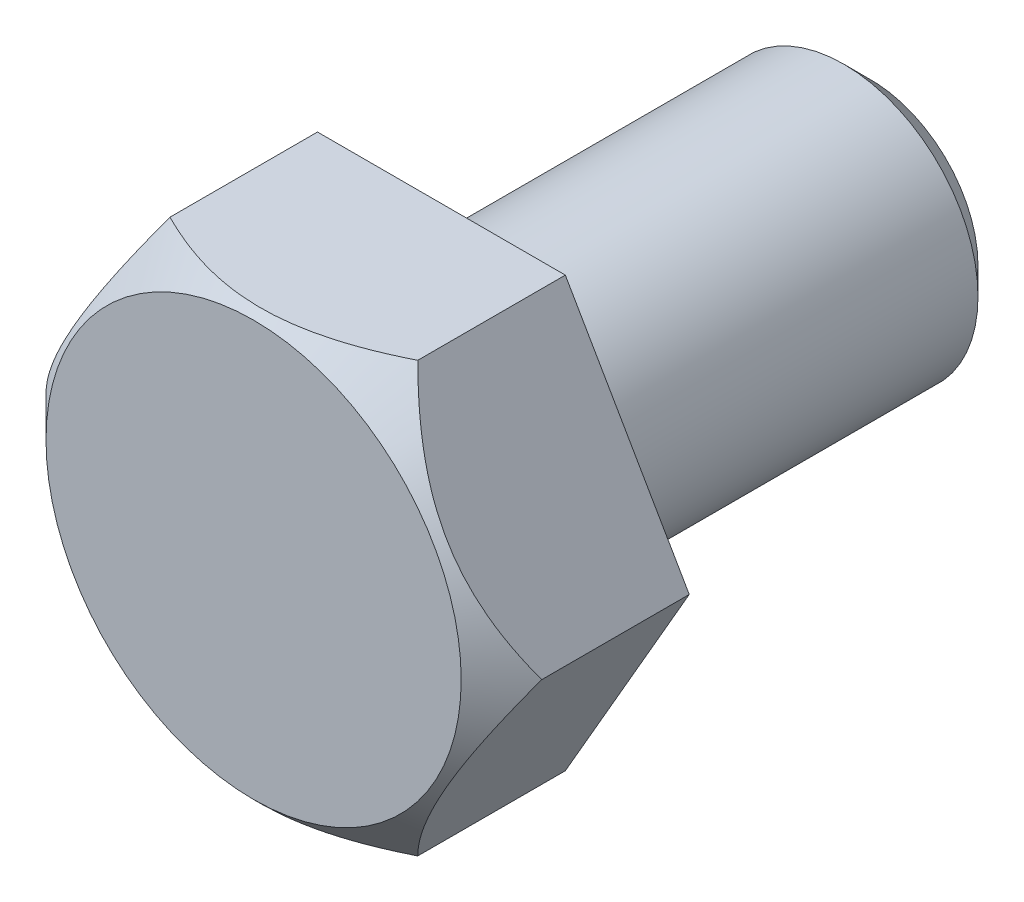
ISO-10303-21;
HEADER;
FILE_DESCRIPTION(('STEP AP214'),'2;1');
FILE_NAME('part.step','',(''),(''),'','','');
FILE_SCHEMA(('AUTOMOTIVE_DESIGN { 1 0 10303 214 1 1 1 1 }'));
ENDSEC;
DATA;
#1=APPLICATION_CONTEXT('core data for automotive mechanical design processes');
#2=APPLICATION_PROTOCOL_DEFINITION('international standard','automotive_design',2000,#1);
#3=PRODUCT_CONTEXT('',#1,'mechanical');
#4=PRODUCT('Part','Part','',(#3));
#5=PRODUCT_RELATED_PRODUCT_CATEGORY('part','',(#4));
#6=PRODUCT_DEFINITION_FORMATION('','',#4);
#7=PRODUCT_DEFINITION_CONTEXT('part definition',#1,'design');
#8=PRODUCT_DEFINITION('design','',#6,#7);
#9=PRODUCT_DEFINITION_SHAPE('','',#8);
#10=(LENGTH_UNIT() NAMED_UNIT(*) SI_UNIT(.MILLI.,.METRE.));
#11=(NAMED_UNIT(*) PLANE_ANGLE_UNIT() SI_UNIT($,.RADIAN.));
#12=(NAMED_UNIT(*) SI_UNIT($,.STERADIAN.) SOLID_ANGLE_UNIT());
#13=UNCERTAINTY_MEASURE_WITH_UNIT(LENGTH_MEASURE(1.E-05),#10,'distance_accuracy_value','');
#14=(GEOMETRIC_REPRESENTATION_CONTEXT(3) GLOBAL_UNCERTAINTY_ASSIGNED_CONTEXT((#13)) GLOBAL_UNIT_ASSIGNED_CONTEXT((#10,
#11,#12)) REPRESENTATION_CONTEXT('',''));
#15=CARTESIAN_POINT('',(0.,0.,0.));
#16=DIRECTION('',(0.,0.,1.));
#17=DIRECTION('',(1.,0.,0.));
#18=AXIS2_PLACEMENT_3D('',#15,#16,#17);
#19=CARTESIAN_POINT('',(2.30940107675854,-3.99999999999995,3.5));
#20=DIRECTION('',(-0.866025403784441,0.499999999999995,0.));
#21=DIRECTION('',(-0.499999999999995,-0.866025403784442,0.));
#22=AXIS2_PLACEMENT_3D('',#19,#20,#21);
#23=PLANE('',#22);
#24=CARTESIAN_POINT('',(2.3092856067047,-4.00019999999995,2.74988452561613));
#25=CARTESIAN_POINT('',(2.34899632674699,-3.93141901528157,2.78959114404243));
#26=CARTESIAN_POINT('',(2.38901092670863,-3.86211169510345,2.82807958288684));
#27=CARTESIAN_POINT('',(2.46971048312827,-3.72233596323636,2.90224877626448));
#28=CARTESIAN_POINT('',(2.51039579126541,-3.65186694242125,2.93792799726834));
#29=CARTESIAN_POINT('',(2.63392971018405,-3.43789991839606,3.04049913234899));
#30=CARTESIAN_POINT('',(2.71782823500147,-3.29258341073222,3.10248688898742));
#31=CARTESIAN_POINT('',(2.88698352725109,-2.99959785018671,3.20864413099057));
#32=CARTESIAN_POINT('',(2.9721975672662,-2.85200280336232,3.25308094454654));
#33=CARTESIAN_POINT('',(3.14450730387844,-2.5535535849111,3.32155101787052));
#34=CARTESIAN_POINT('',(3.23159772331383,-2.40270855359654,3.34563536213866));
#35=CARTESIAN_POINT('',(3.38169462438281,-2.14273309488641,3.36736511913944));
#36=CARTESIAN_POINT('',(3.44450772236847,-2.03393761779445,3.37058108535911));
#37=CARTESIAN_POINT('',(3.57003196860173,-1.81652324573664,3.36515994177497));
#38=CARTESIAN_POINT('',(3.63274307339633,-1.70790442603362,3.35651867682814));
#39=CARTESIAN_POINT('',(3.75757108217471,-1.49169597262182,3.32787596150354));
#40=CARTESIAN_POINT('',(3.81968724243515,-1.38410762707964,3.3078618054487));
#41=CARTESIAN_POINT('',(3.94285275199687,-1.17077870677863,3.25756584263531));
#42=CARTESIAN_POINT('',(4.00390218271577,-1.06503799100033,3.2272848231216));
#43=CARTESIAN_POINT('',(4.11227961083267,-0.877322779108212,3.16498474730574));
#44=CARTESIAN_POINT('',(4.15984755582569,-0.794932681568665,3.13460372013987));
#45=CARTESIAN_POINT('',(4.25412951504788,-0.631631537958687,3.06894553543963));
#46=CARTESIAN_POINT('',(4.30084350325071,-0.550720536967222,3.03366822896019));
#47=CARTESIAN_POINT('',(4.39327037218423,-0.390632503989856,2.95900831297905));
#48=CARTESIAN_POINT('',(4.43898588170051,-0.311450918813753,2.91963861299638));
#49=CARTESIAN_POINT('',(4.52957030284814,-0.15455409901184,2.83731089185669));
#50=CARTESIAN_POINT('',(4.5744397134526,-0.0768380001392329,2.79435507219803));
#51=CARTESIAN_POINT('',(4.61891762357082,0.000199999999999569,2.74988452561613));
#52=B_SPLINE_CURVE_WITH_KNOTS('',3,(#24,#25,#26,#27,#28,#29,#30,#31,#32,#33,#34,#35,#36,#37,#38,
#39,#40,#41,#42,#43,#44,#45,#46,#47,#48,#49,#50,#51),.UNSPECIFIED.,.F.,.F.,(4,2,2,2,2,2,2,2,2,2,
2,2,2,4),(0.,0.266361961703659,0.532868334400101,1.0687586568546,1.59613884594048,
2.12219135055576,2.49866160599654,2.8752638220349,3.25228760372073,3.62928248242854,
3.92874944437156,4.22822551811339,4.52678401907566,4.82516056577913),.UNSPECIFIED.);
#53=CARTESIAN_POINT('',(2.30940107675854,-3.99999999999995,2.74999999999999));
#54=VERTEX_POINT('',#53);
#55=CARTESIAN_POINT('',(4.61880215351698,0.,2.74999999999998));
#56=VERTEX_POINT('',#55);
#57=EDGE_CURVE('E107',#54,#56,#52,.T.);
#58=ORIENTED_EDGE('',*,*,#57,.F.);
#59=DIRECTION('',(0.,0.,-1.));
#60=VECTOR('',#59,1.);
#61=CARTESIAN_POINT('',(2.30940107675854,-3.99999999999995,3.5));
#62=LINE('',#61,#60);
#63=CARTESIAN_POINT('',(2.30940107675854,-3.99999999999995,0.));
#64=VERTEX_POINT('',#63);
#65=EDGE_CURVE('E76',#54,#64,#62,.T.);
#66=ORIENTED_EDGE('',*,*,#65,.T.);
#67=DIRECTION('',(0.499999999999995,0.866025403784441,0.));
#68=VECTOR('',#67,1.);
#69=CARTESIAN_POINT('',(2.30940107675854,-3.99999999999995,0.));
#70=LINE('',#69,#68);
#71=CARTESIAN_POINT('',(4.61880215351698,0.,0.));
#72=VERTEX_POINT('',#71);
#73=EDGE_CURVE('E163',#64,#72,#70,.T.);
#74=ORIENTED_EDGE('',*,*,#73,.T.);
#75=DIRECTION('',(0.,0.,-1.));
#76=VECTOR('',#75,1.);
#77=CARTESIAN_POINT('',(4.61880215351698,0.,3.5));
#78=LINE('',#77,#76);
#79=EDGE_CURVE('E114',#56,#72,#78,.T.);
#80=ORIENTED_EDGE('',*,*,#79,.F.);
#81=EDGE_LOOP('',(#58,#66,#74,#80));
#82=FACE_BOUND('',#81,.T.);
#83=ADVANCED_FACE('F50',(#82),#23,.F.);
#84=CARTESIAN_POINT('',(4.61880215351698,0.,3.5));
#85=DIRECTION('',(-0.866025403784438,-0.500000000000001,0.));
#86=DIRECTION('',(0.500000000000001,-0.866025403784438,0.));
#87=AXIS2_PLACEMENT_3D('',#84,#85,#86);
#88=PLANE('',#87);
#89=CARTESIAN_POINT('',(4.61891762357082,-0.000200000000000034,2.74988452561613));
#90=CARTESIAN_POINT('',(4.57920690352853,0.0685809847183838,2.78959114404243));
#91=CARTESIAN_POINT('',(4.53919230356689,0.137888304896502,2.82807958288684));
#92=CARTESIAN_POINT('',(4.45849274714724,0.277664036763594,2.90224877626448));
#93=CARTESIAN_POINT('',(4.41780743901011,0.348133057578705,2.93792799726834));
#94=CARTESIAN_POINT('',(4.29427352009146,0.562100081603903,3.04049913234899));
#95=CARTESIAN_POINT('',(4.21037499527404,0.707416589267746,3.10248688898743));
#96=CARTESIAN_POINT('',(4.04121970302442,1.00040214981326,3.20864413099058));
#97=CARTESIAN_POINT('',(3.9560056630093,1.14799719663764,3.25308094454655));
#98=CARTESIAN_POINT('',(3.78369592639705,1.44644641508887,3.32155101787054));
#99=CARTESIAN_POINT('',(3.69660550696167,1.59729144640344,3.34563536213868));
#100=CARTESIAN_POINT('',(3.54650860589268,1.85726690511356,3.36736511913945));
#101=CARTESIAN_POINT('',(3.48369550790702,1.96606238220553,3.37058108535913));
#102=CARTESIAN_POINT('',(3.35817126167376,2.18347675426333,3.36515994177498));
#103=CARTESIAN_POINT('',(3.29546015687916,2.29209557396635,3.35651867682816));
#104=CARTESIAN_POINT('',(3.17063214810078,2.50830402737816,3.32787596150355));
#105=CARTESIAN_POINT('',(3.10851598784034,2.61589237292033,3.30786180544872));
#106=CARTESIAN_POINT('',(2.98535047827861,2.82922129322134,3.25756584263533));
#107=CARTESIAN_POINT('',(2.92430104755971,2.93496200899964,3.22728482312162));
#108=CARTESIAN_POINT('',(2.81592361944281,3.12267722089176,3.16498474730576));
#109=CARTESIAN_POINT('',(2.76835567444979,3.20506731843131,3.13460372013988));
#110=CARTESIAN_POINT('',(2.67407371522759,3.36836846204129,3.06894553543965));
#111=CARTESIAN_POINT('',(2.62735972702477,3.44927946303276,3.03366822896021));
#112=CARTESIAN_POINT('',(2.53493285809125,3.60936749601012,2.95900831297906));
#113=CARTESIAN_POINT('',(2.48921734857496,3.68854908118623,2.91963861299639));
#114=CARTESIAN_POINT('',(2.39863292742733,3.84544590098814,2.83731089185669));
#115=CARTESIAN_POINT('',(2.35376351682286,3.92316199986075,2.79435507219804));
#116=CARTESIAN_POINT('',(2.30928560670464,4.00019999999999,2.74988452561613));
#117=B_SPLINE_CURVE_WITH_KNOTS('',3,(#89,#90,#91,#92,#93,#94,#95,#96,#97,#98,#99,#100,#101,#102,
#103,#104,#105,#106,#107,#108,#109,#110,#111,#112,#113,#114,#115,#116),.UNSPECIFIED.,.F.,.F.,(4,
2,2,2,2,2,2,2,2,2,2,2,2,4),(0.,0.266361961703664,0.532868334400112,1.06875865685462,
1.59613884594051,2.1221913505558,2.49866160599658,2.87526382203494,3.25228760372076,
3.62928248242857,3.9287494443716,4.22822551811344,4.52678401907572,4.8251605657792),.UNSPECIFIED.);
#118=CARTESIAN_POINT('',(2.30940107675848,3.99999999999999,2.74999999999999));
#119=VERTEX_POINT('',#118);
#120=EDGE_CURVE('E117',#56,#119,#117,.T.);
#121=ORIENTED_EDGE('',*,*,#120,.F.);
#122=ORIENTED_EDGE('',*,*,#79,.T.);
#123=DIRECTION('',(-0.500000000000001,0.866025403784438,0.));
#124=VECTOR('',#123,1.);
#125=CARTESIAN_POINT('',(4.61880215351698,0.,0.));
#126=LINE('',#125,#124);
#127=CARTESIAN_POINT('',(2.30940107675848,3.99999999999999,0.));
#128=VERTEX_POINT('',#127);
#129=EDGE_CURVE('E166',#72,#128,#126,.T.);
#130=ORIENTED_EDGE('',*,*,#129,.T.);
#131=DIRECTION('',(0.,0.,-1.));
#132=VECTOR('',#131,1.);
#133=CARTESIAN_POINT('',(2.30940107675848,3.99999999999999,3.5));
#134=LINE('',#133,#132);
#135=EDGE_CURVE('E140',#119,#128,#134,.T.);
#136=ORIENTED_EDGE('',*,*,#135,.F.);
#137=EDGE_LOOP('',(#121,#122,#130,#136));
#138=FACE_BOUND('',#137,.T.);
#139=ADVANCED_FACE('F191',(#138),#88,.F.);
#140=CARTESIAN_POINT('',(2.30940107675848,3.99999999999999,3.5));
#141=DIRECTION('',(0.,-1.,0.));
#142=DIRECTION('',(1.,0.,0.));
#143=AXIS2_PLACEMENT_3D('',#140,#141,#142);
#144=PLANE('',#143);
#145=CARTESIAN_POINT('',(7.03541670301107,4.,-0.724224980071982));
#146=CARTESIAN_POINT('',(6.93155938441257,4.,-0.633942274904454));
#147=CARTESIAN_POINT('',(6.82746278255308,4.,-0.54393479929332));
#148=CARTESIAN_POINT('',(6.61872732492529,4.,-0.364547573926703));
#149=CARTESIAN_POINT('',(6.5140884604606,4.,-0.275167834292847));
#150=CARTESIAN_POINT('',(6.1991723319662,4.,-0.00800934197884602));
#151=CARTESIAN_POINT('',(5.98799006379115,4.,0.168706266543014));
#152=CARTESIAN_POINT('',(5.5578236621649,4.,0.522339520698526));
#153=CARTESIAN_POINT('',(5.33877060213612,4.,0.699173621387656));
#154=CARTESIAN_POINT('',(4.89658523800347,3.99999999999999,1.04756816046889));
#155=CARTESIAN_POINT('',(4.6734539649998,3.99999999999999,1.21912990325132));
#156=CARTESIAN_POINT('',(4.2214570660848,3.99999999999999,1.55522058422523));
#157=CARTESIAN_POINT('',(3.99258454141447,3.99999999999999,1.71974034869095));
#158=CARTESIAN_POINT('',(3.64373025107837,3.99999999999999,1.95865916317698));
#159=CARTESIAN_POINT('',(3.52646531426569,3.99999999999999,2.03702330135544));
#160=CARTESIAN_POINT('',(3.28982729390818,3.99999999999999,2.19049799353193));
#161=CARTESIAN_POINT('',(3.17045435091161,3.99999999999999,2.26560876329929));
#162=CARTESIAN_POINT('',(2.93015276405725,3.99999999999999,2.41130935179222));
#163=CARTESIAN_POINT('',(2.8092416863462,3.99999999999999,2.48192801273971));
#164=CARTESIAN_POINT('',(2.56467259216722,3.99999999999999,2.61830348469494));
#165=CARTESIAN_POINT('',(2.44101424658743,3.99999999999999,2.68405970907316));
#166=CARTESIAN_POINT('',(2.19082669430139,3.99999999999999,2.80941400218408));
#167=CARTESIAN_POINT('',(2.06430215071911,3.99999999999999,2.86902130455338));
#168=CARTESIAN_POINT('',(1.80797669800711,3.99999999999998,2.98069554378483));
#169=CARTESIAN_POINT('',(1.67817668690262,3.99999999999998,3.03276452158951));
#170=CARTESIAN_POINT('',(1.4121993297807,3.99999999999998,3.12868582636533));
#171=CARTESIAN_POINT('',(1.27594412517202,3.99999999999998,3.17232528506693));
#172=CARTESIAN_POINT('',(1.00016743560628,3.99999999999998,3.24778638132734));
#173=CARTESIAN_POINT('',(0.860646474441666,3.99999999999998,3.27960990041582));
#174=CARTESIAN_POINT('',(0.580023205851227,3.99999999999998,3.32930890414869));
#175=CARTESIAN_POINT('',(0.438936950034429,3.99999999999998,3.34727321976077));
#176=CARTESIAN_POINT('',(0.155649059802944,3.99999999999998,3.36826573486213));
#177=CARTESIAN_POINT('',(0.0134475599646883,3.99999999999998,3.37129570952537));
#178=CARTESIAN_POINT('',(-0.270726739537468,3.99999999999998,3.36217263674129));
#179=CARTESIAN_POINT('',(-0.412698592885606,3.99999999999998,3.34999076148564));
#180=CARTESIAN_POINT('',(-0.694669093402682,3.99999999999998,3.31133574069337));
#181=CARTESIAN_POINT('',(-0.834667333622428,3.99999999999998,3.28485969074757));
#182=CARTESIAN_POINT('',(-1.11266206762068,3.99999999999997,3.21914938279232));
#183=CARTESIAN_POINT('',(-1.25063648509201,3.99999999999997,3.1798233914403));
#184=CARTESIAN_POINT('',(-1.52306437348178,3.99999999999997,3.09058442291957));
#185=CARTESIAN_POINT('',(-1.65751777090726,3.99999999999997,3.04067122496552));
#186=CARTESIAN_POINT('',(-1.95075534696223,3.99999999999997,2.92088730103197));
#187=CARTESIAN_POINT('',(-2.10871947210615,3.99999999999997,2.84902667003862));
#188=CARTESIAN_POINT('',(-2.41995785502917,3.99999999999997,2.69570440171665));
#189=CARTESIAN_POINT('',(-2.57322936707685,3.99999999999997,2.61423727376071));
#190=CARTESIAN_POINT('',(-2.87593985912462,3.99999999999997,2.44382958499145));
#191=CARTESIAN_POINT('',(-3.02537033455799,3.99999999999997,2.35487404000103));
#192=CARTESIAN_POINT('',(-3.32067760110043,3.99999999999997,2.1713481668299));
#193=CARTESIAN_POINT('',(-3.46655508273657,3.99999999999997,2.07677894215257));
#194=CARTESIAN_POINT('',(-3.75613792247003,3.99999999999996,1.88273212105026));
#195=CARTESIAN_POINT('',(-3.89982728031654,3.99999999999996,1.78323075943282));
#196=CARTESIAN_POINT('',(-4.18471570154391,3.99999999999996,1.58072702480272));
#197=CARTESIAN_POINT('',(-4.3259146759977,3.99999999999996,1.47772452715371));
#198=CARTESIAN_POINT('',(-4.60605919266683,3.99999999999996,1.26904339676688));
#199=CARTESIAN_POINT('',(-4.74500717361247,3.99999999999996,1.16336802928544));
#200=CARTESIAN_POINT('',(-5.02114781647581,3.99999999999996,0.949744870496179));
#201=CARTESIAN_POINT('',(-5.15834041982618,3.99999999999996,0.841797003683742));
#202=CARTESIAN_POINT('',(-5.59225662143447,3.99999999999996,0.495594258971377));
#203=CARTESIAN_POINT('',(-5.88621521753508,3.99999999999996,0.25387204534321));
#204=CARTESIAN_POINT('',(-6.32175787500157,3.99999999999996,-0.11174574003361));
#205=CARTESIAN_POINT('',(-6.46523008675844,3.99999999999996,-0.23341623576313));
#206=CARTESIAN_POINT('',(-6.75108799363205,3.99999999999995,-0.477962064553898));
#207=CARTESIAN_POINT('',(-6.89347392844396,3.99999999999995,-0.600837117293688));
#208=CARTESIAN_POINT('',(-7.0354167030111,3.99999999999995,-0.724224980071986));
#209=B_SPLINE_CURVE_WITH_KNOTS('',3,(#145,#146,#147,#148,#149,#150,#151,#152,#153,#154,#155,
#156,#157,#158,#159,#160,#161,#162,#163,#164,#165,#166,#167,#168,#169,#170,#171,#172,#173,#174,
#175,#176,#177,#178,#179,#180,#181,#182,#183,#184,#185,#186,#187,#188,#189,#190,#191,#192,#193,
#194,#195,#196,#197,#198,#199,#200,#201,#202,#203,#204,#205,#206,#207,#208),.UNSPECIFIED.,.F.,
.F.,(4,2,2,2,2,2,2,2,2,2,2,2,2,2,2,2,2,2,2,2,2,2,2,2,2,2,2,2,2,2,2,4),(0.,0.412837919041297,
0.825682479476195,1.65174781579247,2.49625284400118,3.3405472301666,4.18590995295651,
4.60898568401132,5.03203331281586,5.45201220214164,5.87204167750725,6.29143093409917,
6.71070643112705,7.1394804437844,7.56818615062851,7.99412068590419,8.4200045911502,
8.84669681051561,9.27347576139855,9.70337052055933,10.1332742456163,10.6534593943187,
11.1739433110651,11.6954946576524,12.2169438181586,12.7412111686226,13.2654972019789,
13.7891710468256,14.3128623184724,15.4544601686794,16.0188080093752,16.5830274950814),.UNSPECIFIED.);
#210=CARTESIAN_POINT('',(-2.30940107675851,3.99999999999997,2.75));
#211=VERTEX_POINT('',#210);
#212=EDGE_CURVE('E194',#119,#211,#209,.T.);
#213=ORIENTED_EDGE('',*,*,#212,.F.);
#214=ORIENTED_EDGE('',*,*,#135,.T.);
#215=DIRECTION('',(-1.,0.,0.));
#216=VECTOR('',#215,1.);
#217=CARTESIAN_POINT('',(2.30940107675848,3.99999999999999,0.));
#218=LINE('',#217,#216);
#219=CARTESIAN_POINT('',(-2.30940107675851,3.99999999999997,0.));
#220=VERTEX_POINT('',#219);
#221=EDGE_CURVE('E170',#128,#220,#218,.T.);
#222=ORIENTED_EDGE('',*,*,#221,.T.);
#223=DIRECTION('',(0.,0.,-1.));
#224=VECTOR('',#223,1.);
#225=CARTESIAN_POINT('',(-2.30940107675851,3.99999999999997,3.5));
#226=LINE('',#225,#224);
#227=EDGE_CURVE('E137',#211,#220,#226,.T.);
#228=ORIENTED_EDGE('',*,*,#227,.F.);
#229=EDGE_LOOP('',(#213,#214,#222,#228));
#230=FACE_BOUND('',#229,.T.);
#231=ADVANCED_FACE('F249',(#230),#144,.F.);
#232=CARTESIAN_POINT('',(-2.30940107675851,3.99999999999997,3.5));
#233=DIRECTION('',(0.866025403784441,-0.499999999999995,0.));
#234=DIRECTION('',(0.499999999999995,0.866025403784442,0.));
#235=AXIS2_PLACEMENT_3D('',#232,#233,#234);
#236=PLANE('',#235);
#237=CARTESIAN_POINT('',(-2.30928560670467,4.00019999999997,2.74988452561614));
#238=CARTESIAN_POINT('',(-2.34899632674696,3.93141901528159,2.78959114404244));
#239=CARTESIAN_POINT('',(-2.38901092670861,3.86211169510347,2.82807958288685));
#240=CARTESIAN_POINT('',(-2.46971048312825,3.72233596323637,2.90224877626449));
#241=CARTESIAN_POINT('',(-2.51039579126538,3.65186694242126,2.93792799726836));
#242=CARTESIAN_POINT('',(-2.63392971018403,3.43789991839606,3.04049913234901));
#243=CARTESIAN_POINT('',(-2.71782823500145,3.29258341073222,3.10248688898744));
#244=CARTESIAN_POINT('',(-2.88698352725107,2.99959785018671,3.2086441309906));
#245=CARTESIAN_POINT('',(-2.97219756726618,2.85200280336232,3.25308094454657));
#246=CARTESIAN_POINT('',(-3.14450730387843,2.5535535849111,3.32155101787055));
#247=CARTESIAN_POINT('',(-3.23159772331381,2.40270855359653,3.3456353621387));
#248=CARTESIAN_POINT('',(-3.3816946243828,2.1427330948864,3.36736511913947));
#249=CARTESIAN_POINT('',(-3.44450772236846,2.03393761779444,3.37058108535915));
#250=CARTESIAN_POINT('',(-3.57003196860172,1.81652324573664,3.365159941775));
#251=CARTESIAN_POINT('',(-3.63274307339632,1.70790442603361,3.35651867682817));
#252=CARTESIAN_POINT('',(-3.75757108217469,1.49169597262181,3.32787596150357));
#253=CARTESIAN_POINT('',(-3.81968724243513,1.38410762707963,3.30786180544874));
#254=CARTESIAN_POINT('',(-3.94285275199685,1.17077870677862,3.25756584263535));
#255=CARTESIAN_POINT('',(-4.00390218271576,1.06503799100033,3.22728482312163));
#256=CARTESIAN_POINT('',(-4.11227961083266,0.87732277910821,3.16498474730578));
#257=CARTESIAN_POINT('',(-4.15984755582567,0.794932681568661,3.1346037201399));
#258=CARTESIAN_POINT('',(-4.25412951504787,0.631631537958676,3.06894553543966));
#259=CARTESIAN_POINT('',(-4.3008435032507,0.550720536967208,3.03366822896022));
#260=CARTESIAN_POINT('',(-4.39327037218422,0.390632503989836,2.95900831297908));
#261=CARTESIAN_POINT('',(-4.4389858817005,0.311450918813731,2.9196386129964));
#262=CARTESIAN_POINT('',(-4.52957030284814,0.154554099011813,2.8373108918567));
#263=CARTESIAN_POINT('',(-4.5744397134526,0.0768380001392031,2.79435507219805));
#264=CARTESIAN_POINT('',(-4.61891762357082,-0.000200000000032271,2.74988452561614));
#265=B_SPLINE_CURVE_WITH_KNOTS('',3,(#237,#238,#239,#240,#241,#242,#243,#244,#245,#246,#247,
#248,#249,#250,#251,#252,#253,#254,#255,#256,#257,#258,#259,#260,#261,#262,#263,#264),
.UNSPECIFIED.,.F.,.F.,(4,2,2,2,2,2,2,2,2,2,2,2,2,4),(0.,0.266361961703664,0.532868334400112,
1.06875865685462,1.59613884594051,2.1221913505558,2.49866160599658,2.87526382203493,
3.25228760372075,3.62928248242856,3.92874944437159,4.22822551811343,4.52678401907572,
4.8251605657792),.UNSPECIFIED.);
#266=CARTESIAN_POINT('',(-4.61880215351698,0.,2.75));
#267=VERTEX_POINT('',#266);
#268=EDGE_CURVE('E198',#211,#267,#265,.T.);
#269=ORIENTED_EDGE('',*,*,#268,.F.);
#270=ORIENTED_EDGE('',*,*,#227,.T.);
#271=DIRECTION('',(-0.499999999999995,-0.866025403784441,0.));
#272=VECTOR('',#271,1.);
#273=CARTESIAN_POINT('',(-2.30940107675851,3.99999999999997,0.));
#274=LINE('',#273,#272);
#275=CARTESIAN_POINT('',(-4.61880215351698,0.,0.));
#276=VERTEX_POINT('',#275);
#277=EDGE_CURVE('E174',#220,#276,#274,.T.);
#278=ORIENTED_EDGE('',*,*,#277,.T.);
#279=DIRECTION('',(0.,0.,-1.));
#280=VECTOR('',#279,1.);
#281=CARTESIAN_POINT('',(-4.61880215351698,0.,3.5));
#282=LINE('',#281,#280);
#283=EDGE_CURVE('E129',#267,#276,#282,.T.);
#284=ORIENTED_EDGE('',*,*,#283,.F.);
#285=EDGE_LOOP('',(#269,#270,#278,#284));
#286=FACE_BOUND('',#285,.T.);
#287=ADVANCED_FACE('F246',(#286),#236,.F.);
#288=CARTESIAN_POINT('',(-4.61880215351698,0.,3.5));
#289=DIRECTION('',(0.866025403784434,0.500000000000007,0.));
#290=DIRECTION('',(-0.500000000000007,0.866025403784435,0.));
#291=AXIS2_PLACEMENT_3D('',#288,#289,#290);
#292=PLANE('',#291);
#293=CARTESIAN_POINT('',(-4.61891762357082,0.00019999999996778,2.74988452561614));
#294=CARTESIAN_POINT('',(-4.57920690352853,-0.0685809847184151,2.78959114404244));
#295=CARTESIAN_POINT('',(-4.53919230356689,-0.137888304896533,2.82807958288685));
#296=CARTESIAN_POINT('',(-4.45849274714724,-0.277664036763623,2.90224877626449));
#297=CARTESIAN_POINT('',(-4.41780743901011,-0.348133057578733,2.93792799726836));
#298=CARTESIAN_POINT('',(-4.29427352009146,-0.562100081603929,3.04049913234901));
#299=CARTESIAN_POINT('',(-4.21037499527404,-0.70741658926777,3.10248688898744));
#300=CARTESIAN_POINT('',(-4.04121970302442,-1.00040214981328,3.2086441309906));
#301=CARTESIAN_POINT('',(-3.9560056630093,-1.14799719663766,3.25308094454656));
#302=CARTESIAN_POINT('',(-3.78369592639705,-1.44644641508888,3.32155101787055));
#303=CARTESIAN_POINT('',(-3.69660550696166,-1.59729144640345,3.3456353621387));
#304=CARTESIAN_POINT('',(-3.54650860589268,-1.85726690511357,3.36736511913947));
#305=CARTESIAN_POINT('',(-3.48369550790702,-1.96606238220554,3.37058108535915));
#306=CARTESIAN_POINT('',(-3.35817126167375,-2.18347675426334,3.365159941775));
#307=CARTESIAN_POINT('',(-3.29546015687915,-2.29209557396636,3.35651867682817));
#308=CARTESIAN_POINT('',(-3.17063214810077,-2.50830402737816,3.32787596150357));
#309=CARTESIAN_POINT('',(-3.10851598784033,-2.61589237292033,3.30786180544874));
#310=CARTESIAN_POINT('',(-2.98535047827861,-2.82922129322134,3.25756584263535));
#311=CARTESIAN_POINT('',(-2.9243010475597,-2.93496200899964,3.22728482312164));
#312=CARTESIAN_POINT('',(-2.8159236194428,-3.12267722089176,3.16498474730578));
#313=CARTESIAN_POINT('',(-2.76835567444978,-3.20506731843131,3.1346037201399));
#314=CARTESIAN_POINT('',(-2.67407371522758,-3.36836846204129,3.06894553543966));
#315=CARTESIAN_POINT('',(-2.62735972702475,-3.44927946303276,3.03366822896022));
#316=CARTESIAN_POINT('',(-2.53493285809123,-3.60936749601013,2.95900831297908));
#317=CARTESIAN_POINT('',(-2.48921734857494,-3.68854908118624,2.9196386129964));
#318=CARTESIAN_POINT('',(-2.3986329274273,-3.84544590098815,2.8373108918567));
#319=CARTESIAN_POINT('',(-2.35376351682284,-3.92316199986077,2.79435507219805));
#320=CARTESIAN_POINT('',(-2.30928560670462,-4.0002,2.74988452561614));
#321=B_SPLINE_CURVE_WITH_KNOTS('',3,(#293,#294,#295,#296,#297,#298,#299,#300,#301,#302,#303,
#304,#305,#306,#307,#308,#309,#310,#311,#312,#313,#314,#315,#316,#317,#318,#319,#320),
.UNSPECIFIED.,.F.,.F.,(4,2,2,2,2,2,2,2,2,2,2,2,2,4),(0.,0.266361961703662,0.532868334400108,
1.06875865685461,1.5961388459405,2.12219135055579,2.49866160599656,2.87526382203492,
3.25228760372074,3.62928248242855,3.92874944437158,4.22822551811343,4.52678401907572,
4.8251605657792),.UNSPECIFIED.);
#322=CARTESIAN_POINT('',(-2.30940107675845,-4.,2.75));
#323=VERTEX_POINT('',#322);
#324=EDGE_CURVE('E68',#267,#323,#321,.T.);
#325=ORIENTED_EDGE('',*,*,#324,.F.);
#326=ORIENTED_EDGE('',*,*,#283,.T.);
#327=DIRECTION('',(0.500000000000007,-0.866025403784434,0.));
#328=VECTOR('',#327,1.);
#329=CARTESIAN_POINT('',(-4.61880215351698,0.,0.));
#330=LINE('',#329,#328);
#331=CARTESIAN_POINT('',(-2.30940107675845,-4.,0.));
#332=VERTEX_POINT('',#331);
#333=EDGE_CURVE('E131',#276,#332,#330,.T.);
#334=ORIENTED_EDGE('',*,*,#333,.T.);
#335=DIRECTION('',(0.,0.,-1.));
#336=VECTOR('',#335,1.);
#337=CARTESIAN_POINT('',(-2.30940107675845,-4.,3.5));
#338=LINE('',#337,#336);
#339=EDGE_CURVE('E124',#323,#332,#338,.T.);
#340=ORIENTED_EDGE('',*,*,#339,.F.);
#341=EDGE_LOOP('',(#325,#326,#334,#340));
#342=FACE_BOUND('',#341,.T.);
#343=ADVANCED_FACE('F182',(#342),#292,.F.);
#344=CARTESIAN_POINT('',(-2.30940107675845,-4.,3.5));
#345=DIRECTION('',(0.,1.,0.));
#346=DIRECTION('',(-1.,0.,0.));
#347=AXIS2_PLACEMENT_3D('',#344,#345,#346);
#348=PLANE('',#347);
#349=CARTESIAN_POINT('',(-7.03541670301105,-4.00000000000005,-0.724224980071985));
#350=CARTESIAN_POINT('',(-6.93155938441254,-4.00000000000005,-0.633942274904457));
#351=CARTESIAN_POINT('',(-6.82746278255305,-4.00000000000005,-0.543934799293323));
#352=CARTESIAN_POINT('',(-6.61872732492527,-4.00000000000005,-0.364547573926706));
#353=CARTESIAN_POINT('',(-6.51408846046058,-4.00000000000004,-0.275167834292849));
#354=CARTESIAN_POINT('',(-6.19917233196617,-4.00000000000004,-0.0080093419788483));
#355=CARTESIAN_POINT('',(-5.98799006379112,-4.00000000000004,0.168706266543011));
#356=CARTESIAN_POINT('',(-5.55782366216488,-4.00000000000003,0.522339520698524));
#357=CARTESIAN_POINT('',(-5.3387706021361,-4.00000000000003,0.699173621387655));
#358=CARTESIAN_POINT('',(-4.89658523800345,-4.00000000000003,1.04756816046889));
#359=CARTESIAN_POINT('',(-4.67345396499978,-4.00000000000002,1.21912990325131));
#360=CARTESIAN_POINT('',(-4.22145706608478,-4.00000000000002,1.55522058422523));
#361=CARTESIAN_POINT('',(-3.99258454141445,-4.00000000000002,1.71974034869095));
#362=CARTESIAN_POINT('',(-3.64373025107836,-4.00000000000002,1.95865916317698));
#363=CARTESIAN_POINT('',(-3.52646531426568,-4.00000000000001,2.03702330135543));
#364=CARTESIAN_POINT('',(-3.28982729390816,-4.00000000000001,2.19049799353193));
#365=CARTESIAN_POINT('',(-3.17045435091159,-4.00000000000001,2.26560876329929));
#366=CARTESIAN_POINT('',(-2.93015276405724,-4.00000000000001,2.41130935179222));
#367=CARTESIAN_POINT('',(-2.80924168634619,-4.00000000000001,2.48192801273971));
#368=CARTESIAN_POINT('',(-2.56467259216721,-4.,2.61830348469494));
#369=CARTESIAN_POINT('',(-2.44101424658742,-4.,2.68405970907316));
#370=CARTESIAN_POINT('',(-2.19082669430138,-4.,2.80941400218408));
#371=CARTESIAN_POINT('',(-2.0643021507191,-4.,2.86902130455338));
#372=CARTESIAN_POINT('',(-1.8079766980071,-4.,2.98069554378483));
#373=CARTESIAN_POINT('',(-1.67817668690261,-3.99999999999999,3.03276452158951));
#374=CARTESIAN_POINT('',(-1.41219932978069,-3.99999999999999,3.12868582636533));
#375=CARTESIAN_POINT('',(-1.27594412517201,-3.99999999999999,3.17232528506693));
#376=CARTESIAN_POINT('',(-1.00016743560627,-3.99999999999999,3.24778638132734));
#377=CARTESIAN_POINT('',(-0.860646474441658,-3.99999999999999,3.27960990041582));
#378=CARTESIAN_POINT('',(-0.580023205851221,-3.99999999999998,3.32930890414869));
#379=CARTESIAN_POINT('',(-0.438936950034423,-3.99999999999998,3.34727321976077));
#380=CARTESIAN_POINT('',(-0.155649059802938,-3.99999999999998,3.36826573486213));
#381=CARTESIAN_POINT('',(-0.013447559964683,-3.99999999999998,3.37129570952537));
#382=CARTESIAN_POINT('',(0.270726739537473,-3.99999999999997,3.36217263674129));
#383=CARTESIAN_POINT('',(0.412698592885611,-3.99999999999997,3.34999076148564));
#384=CARTESIAN_POINT('',(0.694669093402687,-3.99999999999997,3.31133574069337));
#385=CARTESIAN_POINT('',(0.834667333622433,-3.99999999999997,3.28485969074757));
#386=CARTESIAN_POINT('',(1.11266206762068,-3.99999999999997,3.21914938279233));
#387=CARTESIAN_POINT('',(1.25063648509201,-3.99999999999996,3.1798233914403));
#388=CARTESIAN_POINT('',(1.52306437348178,-3.99999999999996,3.09058442291957));
#389=CARTESIAN_POINT('',(1.65751777090726,-3.99999999999996,3.04067122496552));
#390=CARTESIAN_POINT('',(1.95075534696223,-3.99999999999996,2.92088730103198));
#391=CARTESIAN_POINT('',(2.10871947210615,-3.99999999999996,2.84902667003862));
#392=CARTESIAN_POINT('',(2.41995785502918,-3.99999999999995,2.69570440171665));
#393=CARTESIAN_POINT('',(2.57322936707686,-3.99999999999995,2.61423727376071));
#394=CARTESIAN_POINT('',(2.87593985912463,-3.99999999999995,2.44382958499146));
#395=CARTESIAN_POINT('',(3.025370334558,-3.99999999999995,2.35487404000104));
#396=CARTESIAN_POINT('',(3.32067760110044,-3.99999999999994,2.17134816682991));
#397=CARTESIAN_POINT('',(3.46655508273658,-3.99999999999994,2.07677894215257));
#398=CARTESIAN_POINT('',(3.75613792247004,-3.99999999999994,1.88273212105026));
#399=CARTESIAN_POINT('',(3.89982728031655,-3.99999999999994,1.78323075943283));
#400=CARTESIAN_POINT('',(4.18471570154392,-3.99999999999993,1.58072702480273));
#401=CARTESIAN_POINT('',(4.32591467599771,-3.99999999999993,1.47772452715371));
#402=CARTESIAN_POINT('',(4.60605919266685,-3.99999999999993,1.26904339676689));
#403=CARTESIAN_POINT('',(4.74500717361249,-3.99999999999993,1.16336802928545));
#404=CARTESIAN_POINT('',(5.02114781647582,-3.99999999999992,0.949744870496187));
#405=CARTESIAN_POINT('',(5.1583404198262,-3.99999999999992,0.841797003683749));
#406=CARTESIAN_POINT('',(5.59225662143448,-3.99999999999992,0.495594258971382));
#407=CARTESIAN_POINT('',(5.8862152175351,-3.99999999999992,0.253872045343214));
#408=CARTESIAN_POINT('',(6.3217578750016,-3.99999999999991,-0.111745740033606));
#409=CARTESIAN_POINT('',(6.46523008675846,-3.99999999999991,-0.233416235763125));
#410=CARTESIAN_POINT('',(6.75108799363207,-3.99999999999991,-0.477962064553893));
#411=CARTESIAN_POINT('',(6.89347392844398,-3.99999999999991,-0.600837117293684));
#412=CARTESIAN_POINT('',(7.03541670301113,-3.9999999999999,-0.724224980071983));
#413=B_SPLINE_CURVE_WITH_KNOTS('',3,(#349,#350,#351,#352,#353,#354,#355,#356,#357,#358,#359,
#360,#361,#362,#363,#364,#365,#366,#367,#368,#369,#370,#371,#372,#373,#374,#375,#376,#377,#378,
#379,#380,#381,#382,#383,#384,#385,#386,#387,#388,#389,#390,#391,#392,#393,#394,#395,#396,#397,
#398,#399,#400,#401,#402,#403,#404,#405,#406,#407,#408,#409,#410,#411,#412),.UNSPECIFIED.,.F.,
.F.,(4,2,2,2,2,2,2,2,2,2,2,2,2,2,2,2,2,2,2,2,2,2,2,2,2,2,2,2,2,2,2,4),(0.,0.412837919041296,
0.825682479476193,1.65174781579247,2.49625284400117,3.3405472301666,4.1859099529565,
4.60898568401131,5.03203331281585,5.45201220214163,5.87204167750724,6.29143093409916,
6.71070643112703,7.13948044378439,7.56818615062849,7.99412068590418,8.42000459115018,
8.84669681051559,9.27347576139853,9.70337052055931,10.1332742456162,10.6534593943187,
11.173943311065,11.6954946576523,12.2169438181586,12.7412111686226,13.2654972019789,
13.7891710468255,14.3128623184724,15.4544601686794,16.0188080093752,16.5830274950814),.UNSPECIFIED.);
#414=EDGE_CURVE('E105',#323,#54,#413,.T.);
#415=ORIENTED_EDGE('',*,*,#414,.F.);
#416=ORIENTED_EDGE('',*,*,#339,.T.);
#417=DIRECTION('',(1.,0.,0.));
#418=VECTOR('',#417,1.);
#419=CARTESIAN_POINT('',(-2.30940107675845,-4.,0.));
#420=LINE('',#419,#418);
#421=EDGE_CURVE('E121',#332,#64,#420,.T.);
#422=ORIENTED_EDGE('',*,*,#421,.T.);
#423=ORIENTED_EDGE('',*,*,#65,.F.);
#424=EDGE_LOOP('',(#415,#416,#422,#423));
#425=FACE_BOUND('',#424,.T.);
#426=ADVANCED_FACE('F119',(#425),#348,.F.);
#427=CARTESIAN_POINT('',(0.,0.,0.));
#428=DIRECTION('',(0.,0.,1.));
#429=DIRECTION('',(1.,0.,0.));
#430=AXIS2_PLACEMENT_3D('',#427,#428,#429);
#431=PLANE('',#430);
#432=CARTESIAN_POINT('',(0.,0.,0.));
#433=DIRECTION('',(0.,0.,-1.));
#434=DIRECTION('',(-1.,0.,0.));
#435=AXIS2_PLACEMENT_3D('',#432,#433,#434);
#436=CIRCLE('',#435,3.25);
#437=CARTESIAN_POINT('',(-3.25,0.,0.));
#438=VERTEX_POINT('',#437);
#439=EDGE_CURVE('E145',#438,#438,#436,.T.);
#440=ORIENTED_EDGE('',*,*,#439,.F.);
#441=EDGE_LOOP('',(#440));
#442=FACE_BOUND('',#441,.T.);
#443=ORIENTED_EDGE('',*,*,#73,.F.);
#444=ORIENTED_EDGE('',*,*,#421,.F.);
#445=ORIENTED_EDGE('',*,*,#333,.F.);
#446=ORIENTED_EDGE('',*,*,#277,.F.);
#447=ORIENTED_EDGE('',*,*,#221,.F.);
#448=ORIENTED_EDGE('',*,*,#129,.F.);
#449=EDGE_LOOP('',(#443,#444,#445,#446,#447,#448));
#450=FACE_BOUND('',#449,.T.);
#451=ADVANCED_FACE('F186',(#442,#450),#431,.F.);
#452=CARTESIAN_POINT('',(0.,0.,-0.25));
#453=DIRECTION('',(0.,0.,1.));
#454=DIRECTION('',(1.,0.,0.));
#455=AXIS2_PLACEMENT_3D('',#452,#453,#454);
#456=CYLINDRICAL_SURFACE('',#455,3.25);
#457=CARTESIAN_POINT('',(0.,0.,-0.25));
#458=DIRECTION('',(0.,0.,-1.));
#459=DIRECTION('',(-1.,0.,0.));
#460=AXIS2_PLACEMENT_3D('',#457,#458,#459);
#461=CIRCLE('',#460,3.25);
#462=CARTESIAN_POINT('',(-3.25,0.,-0.25));
#463=VERTEX_POINT('',#462);
#464=EDGE_CURVE('E149',#463,#463,#461,.T.);
#465=ORIENTED_EDGE('',*,*,#464,.F.);
#466=EDGE_LOOP('',(#465));
#467=FACE_BOUND('',#466,.T.);
#468=ORIENTED_EDGE('',*,*,#439,.T.);
#469=EDGE_LOOP('',(#468));
#470=FACE_BOUND('',#469,.T.);
#471=ADVANCED_FACE('F300',(#467,#470),#456,.T.);
#472=CARTESIAN_POINT('',(0.,0.,-0.25));
#473=DIRECTION('',(0.,0.,-1.));
#474=DIRECTION('',(-1.,0.,0.));
#475=AXIS2_PLACEMENT_3D('',#472,#473,#474);
#476=PLANE('',#475);
#477=CARTESIAN_POINT('',(0.,0.,-0.25));
#478=DIRECTION('',(0.,0.,-1.));
#479=DIRECTION('',(-1.,0.,0.));
#480=AXIS2_PLACEMENT_3D('',#477,#478,#479);
#481=CIRCLE('',#480,2.5);
#482=CARTESIAN_POINT('',(-2.5,0.,-0.25));
#483=VERTEX_POINT('',#482);
#484=EDGE_CURVE('E116',#483,#483,#481,.F.);
#485=ORIENTED_EDGE('',*,*,#484,.T.);
#486=EDGE_LOOP('',(#485));
#487=FACE_BOUND('',#486,.T.);
#488=ORIENTED_EDGE('',*,*,#464,.T.);
#489=EDGE_LOOP('',(#488));
#490=FACE_BOUND('',#489,.T.);
#491=ADVANCED_FACE('F310',(#487,#490),#476,.T.);
#492=CARTESIAN_POINT('',(0.,0.,-8.));
#493=DIRECTION('',(0.,0.,1.));
#494=DIRECTION('',(1.,0.,0.));
#495=AXIS2_PLACEMENT_3D('',#492,#493,#494);
#496=CYLINDRICAL_SURFACE('',#495,2.5);
#497=CARTESIAN_POINT('',(0.,0.,-7.50000000000001));
#498=DIRECTION('',(0.,0.,-1.));
#499=DIRECTION('',(-1.,0.,0.));
#500=AXIS2_PLACEMENT_3D('',#497,#498,#499);
#501=CIRCLE('',#500,2.5);
#502=CARTESIAN_POINT('',(-2.5,0.,-7.50000000000001));
#503=VERTEX_POINT('',#502);
#504=EDGE_CURVE('E11',#503,#503,#501,.F.);
#505=ORIENTED_EDGE('',*,*,#504,.T.);
#506=EDGE_LOOP('',(#505));
#507=FACE_BOUND('',#506,.T.);
#508=ORIENTED_EDGE('',*,*,#484,.F.);
#509=EDGE_LOOP('',(#508));
#510=FACE_BOUND('',#509,.T.);
#511=ADVANCED_FACE('F320',(#507,#510),#496,.T.);
#512=CARTESIAN_POINT('',(0.,0.,-8.));
#513=DIRECTION('',(0.,0.,-1.));
#514=DIRECTION('',(-1.,0.,0.));
#515=AXIS2_PLACEMENT_3D('',#512,#513,#514);
#516=PLANE('',#515);
#517=CARTESIAN_POINT('',(0.,0.,-8.));
#518=DIRECTION('',(0.,0.,-1.));
#519=DIRECTION('',(-1.,0.,0.));
#520=AXIS2_PLACEMENT_3D('',#517,#518,#519);
#521=CIRCLE('',#520,2.00000000000001);
#522=CARTESIAN_POINT('',(-2.00000000000001,0.,-8.));
#523=VERTEX_POINT('',#522);
#524=EDGE_CURVE('E61',#523,#523,#521,.T.);
#525=ORIENTED_EDGE('',*,*,#524,.T.);
#526=EDGE_LOOP('',(#525));
#527=FACE_BOUND('',#526,.T.);
#528=ADVANCED_FACE('F222',(#527),#516,.T.);
#529=CARTESIAN_POINT('',(0.,0.,-8.));
#530=DIRECTION('',(0.,0.,1.));
#531=DIRECTION('',(1.,0.,0.));
#532=AXIS2_PLACEMENT_3D('',#529,#530,#531);
#533=CONICAL_SURFACE('',#532,2.00000000000001,0.785398163397446);
#534=ORIENTED_EDGE('',*,*,#504,.F.);
#535=EDGE_LOOP('',(#534));
#536=FACE_BOUND('',#535,.T.);
#537=ORIENTED_EDGE('',*,*,#524,.F.);
#538=EDGE_LOOP('',(#537));
#539=FACE_BOUND('',#538,.T.);
#540=ADVANCED_FACE('F53',(#536,#539),#533,.T.);
#541=CARTESIAN_POINT('',(0.,0.,3.75000000000001));
#542=DIRECTION('',(0.,0.,-1.));
#543=DIRECTION('',(-1.,0.,0.));
#544=AXIS2_PLACEMENT_3D('',#541,#542,#543);
#545=CONICAL_SURFACE('',#544,3.61880215351697,0.785398163397449);
#546=CARTESIAN_POINT('',(0.,0.,3.5));
#547=DIRECTION('',(0.,0.,1.));
#548=DIRECTION('',(1.,0.,0.));
#549=AXIS2_PLACEMENT_3D('',#546,#547,#548);
#550=CIRCLE('',#549,3.86880215351697);
#551=CARTESIAN_POINT('',(3.86880215351697,0.,3.5));
#552=VERTEX_POINT('',#551);
#553=EDGE_CURVE('E55',#552,#552,#550,.T.);
#554=ORIENTED_EDGE('',*,*,#553,.F.);
#555=EDGE_LOOP('',(#554));
#556=FACE_BOUND('',#555,.T.);
#557=ORIENTED_EDGE('',*,*,#57,.T.);
#558=ORIENTED_EDGE('',*,*,#120,.T.);
#559=ORIENTED_EDGE('',*,*,#212,.T.);
#560=ORIENTED_EDGE('',*,*,#268,.T.);
#561=ORIENTED_EDGE('',*,*,#324,.T.);
#562=ORIENTED_EDGE('',*,*,#414,.T.);
#563=EDGE_LOOP('',(#557,#558,#559,#560,#561,#562));
#564=FACE_BOUND('',#563,.T.);
#565=ADVANCED_FACE('F106',(#556,#564),#545,.T.);
#566=CARTESIAN_POINT('',(0.,0.,3.5));
#567=DIRECTION('',(0.,0.,1.));
#568=DIRECTION('',(1.,0.,0.));
#569=AXIS2_PLACEMENT_3D('',#566,#567,#568);
#570=PLANE('',#569);
#571=ORIENTED_EDGE('',*,*,#553,.T.);
#572=EDGE_LOOP('',(#571));
#573=FACE_BOUND('',#572,.T.);
#574=ADVANCED_FACE('F220',(#573),#570,.T.);
#575=CLOSED_SHELL('',(#83,#139,#231,#287,#343,#426,#451,#471,#491,#511,#528,#540,#565,#574));
#576=MANIFOLD_SOLID_BREP('B2',#575);
#577=ADVANCED_BREP_SHAPE_REPRESENTATION('',(#18,#576),#14);
#578=SHAPE_DEFINITION_REPRESENTATION(#9,#577);
ENDSEC;
END-ISO-10303-21;
